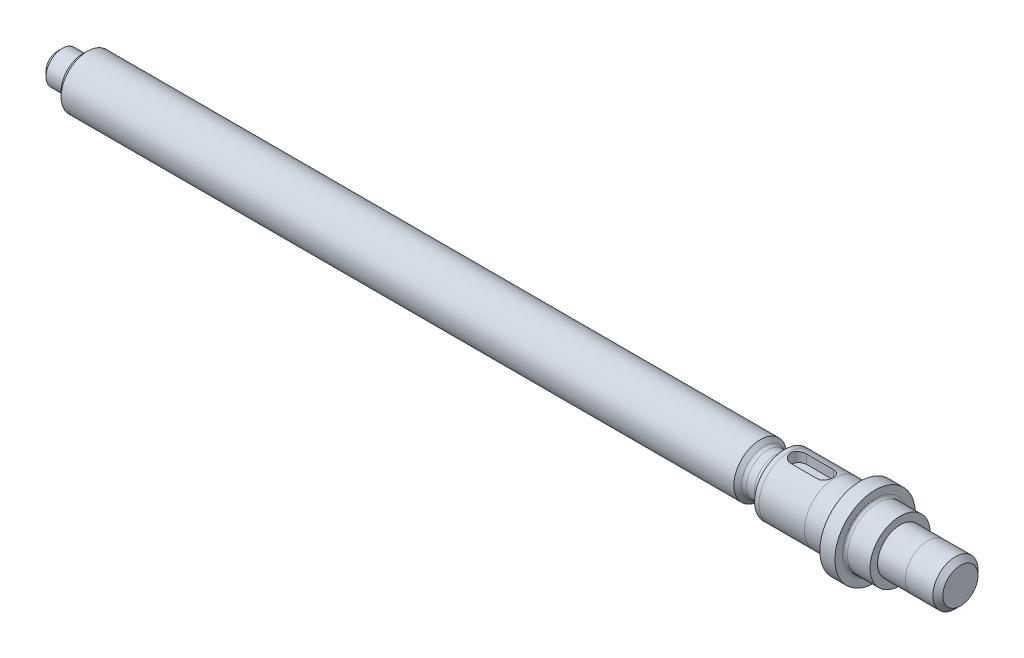
ISO-10303-21;
HEADER;
FILE_DESCRIPTION(('STEP AP214'),'2;1');
FILE_NAME('part.step','',(''),(''),'','','');
FILE_SCHEMA(('AUTOMOTIVE_DESIGN { 1 0 10303 214 1 1 1 1 }'));
ENDSEC;
DATA;
#1=APPLICATION_CONTEXT('core data for automotive mechanical design processes');
#2=APPLICATION_PROTOCOL_DEFINITION('international standard','automotive_design',2000,#1);
#3=PRODUCT_CONTEXT('',#1,'mechanical');
#4=PRODUCT('Part','Part','',(#3));
#5=PRODUCT_RELATED_PRODUCT_CATEGORY('part','',(#4));
#6=PRODUCT_DEFINITION_FORMATION('','',#4);
#7=PRODUCT_DEFINITION_CONTEXT('part definition',#1,'design');
#8=PRODUCT_DEFINITION('design','',#6,#7);
#9=PRODUCT_DEFINITION_SHAPE('','',#8);
#10=(LENGTH_UNIT() NAMED_UNIT(*) SI_UNIT(.MILLI.,.METRE.));
#11=(NAMED_UNIT(*) PLANE_ANGLE_UNIT() SI_UNIT($,.RADIAN.));
#12=(NAMED_UNIT(*) SI_UNIT($,.STERADIAN.) SOLID_ANGLE_UNIT());
#13=UNCERTAINTY_MEASURE_WITH_UNIT(LENGTH_MEASURE(1.E-05),#10,'distance_accuracy_value','');
#14=(GEOMETRIC_REPRESENTATION_CONTEXT(3) GLOBAL_UNCERTAINTY_ASSIGNED_CONTEXT((#13)) GLOBAL_UNIT_ASSIGNED_CONTEXT((#10,
#11,#12)) REPRESENTATION_CONTEXT('',''));
#15=CARTESIAN_POINT('',(0.,0.,0.));
#16=DIRECTION('',(0.,0.,1.));
#17=DIRECTION('',(1.,0.,0.));
#18=AXIS2_PLACEMENT_3D('',#15,#16,#17);
#19=CARTESIAN_POINT('',(55.7564116787131,0.,2.49726946320206));
#20=DIRECTION('',(1.,0.,0.));
#21=DIRECTION('',(0.,0.,-1.));
#22=AXIS2_PLACEMENT_3D('',#19,#20,#21);
#23=CYLINDRICAL_SURFACE('',#22,4.5);
#24=CARTESIAN_POINT('',(43.7564116787131,0.,2.49726946320206));
#25=DIRECTION('',(1.,0.,0.));
#26=DIRECTION('',(0.,0.,-1.));
#27=AXIS2_PLACEMENT_3D('',#24,#25,#26);
#28=CIRCLE('',#27,4.5);
#29=CARTESIAN_POINT('',(43.7564116787131,0.,-2.00273053679794));
#30=VERTEX_POINT('',#29);
#31=EDGE_CURVE('E118',#30,#30,#28,.T.);
#32=ORIENTED_EDGE('',*,*,#31,.T.);
#33=EDGE_LOOP('',(#32));
#34=FACE_BOUND('',#33,.T.);
#35=CARTESIAN_POINT('',(49.2564116787132,0.,2.49726946320206));
#36=DIRECTION('',(1.,0.,0.));
#37=DIRECTION('',(0.,0.,-1.));
#38=AXIS2_PLACEMENT_3D('',#35,#36,#37);
#39=CIRCLE('',#38,4.5);
#40=CARTESIAN_POINT('',(49.2564116787132,0.,-2.00273053679794));
#41=VERTEX_POINT('',#40);
#42=CARTESIAN_POINT('',(49.2564116787132,0.,6.99726946320206));
#43=VERTEX_POINT('',#42);
#44=EDGE_CURVE('E12',#41,#43,#39,.T.);
#45=ORIENTED_EDGE('',*,*,#44,.F.);
#46=EDGE_CURVE('E48',#43,#41,#39,.T.);
#47=ORIENTED_EDGE('',*,*,#46,.F.);
#48=EDGE_LOOP('',(#45,#47));
#49=FACE_BOUND('',#48,.T.);
#50=ADVANCED_FACE('F44',(#34,#49),#23,.T.);
#51=CARTESIAN_POINT('',(55.7564116787131,0.,2.49726946320206));
#52=DIRECTION('',(1.,0.,0.));
#53=DIRECTION('',(0.,0.,-1.));
#54=AXIS2_PLACEMENT_3D('',#51,#52,#53);
#55=CYLINDRICAL_SURFACE('',#54,6.);
#56=DIRECTION('',(1.,0.,0.));
#57=VECTOR('',#56,1.);
#58=CARTESIAN_POINT('',(55.7564116787131,5.78427857343611,4.0916726069797));
#59=LINE('',#58,#57);
#60=CARTESIAN_POINT('',(28.8683989605869,5.78427857343611,4.0916726069797));
#61=VERTEX_POINT('',#60);
#62=CARTESIAN_POINT('',(23.5508562536765,5.78427857343611,4.0916726069797));
#63=VERTEX_POINT('',#62);
#64=EDGE_CURVE('E185',#61,#63,#59,.F.);
#65=ORIENTED_EDGE('',*,*,#64,.T.);
#66=CARTESIAN_POINT('',(23.5508562536765,5.78427857343611,4.0916726069797));
#67=CARTESIAN_POINT('',(23.5068488408463,5.78427537470929,4.0916732538895));
#68=CARTESIAN_POINT('',(23.462863337569,5.78478143129884,4.08984945884592));
#69=CARTESIAN_POINT('',(23.3752232596121,5.78677909814746,4.0825797926963));
#70=CARTESIAN_POINT('',(23.3315686253125,5.78827052636404,4.07713459062591));
#71=CARTESIAN_POINT('',(23.2017691493449,5.79416184620568,4.05544983439344));
#72=CARTESIAN_POINT('',(23.1165194102947,5.7999791682138,4.03386074856213));
#73=CARTESIAN_POINT('',(22.9510220426751,5.81471085083434,3.9771290336548));
#74=CARTESIAN_POINT('',(22.8707735725419,5.82362468872731,3.94198869204124));
#75=CARTESIAN_POINT('',(22.7172652215831,5.84353960117569,3.85919902404648));
#76=CARTESIAN_POINT('',(22.644007635074,5.85454135744235,3.81154561015683));
#77=CARTESIAN_POINT('',(22.5047920720793,5.8776954351342,3.70383066791852));
#78=CARTESIAN_POINT('',(22.4390330883749,5.88986792942943,3.64351634913917));
#79=CARTESIAN_POINT('',(22.3184299097202,5.91381879213698,3.5127301842721));
#80=CARTESIAN_POINT('',(22.2635874850385,5.92559709636882,3.44225669392605));
#81=CARTESIAN_POINT('',(22.1655463804298,5.9476581552028,3.29176803994546));
#82=CARTESIAN_POINT('',(22.1225466286126,5.9579141629704,3.21161901945396));
#83=CARTESIAN_POINT('',(22.0507100073433,5.9755416758513,3.04491505372384));
#84=CARTESIAN_POINT('',(22.0218700973222,5.98291380015703,2.95836148834238));
#85=CARTESIAN_POINT('',(21.9798163830287,5.99380009452295,2.78339123484563));
#86=CARTESIAN_POINT('',(21.9662621012602,5.99739819537028,2.69506169319851));
#87=CARTESIAN_POINT('',(21.9540932252812,6.00062447393384,2.51731209825912));
#88=CARTESIAN_POINT('',(21.9554764723815,6.0002532252786,2.42789220440411));
#89=CARTESIAN_POINT('',(21.9729039161297,5.99564402950704,2.25287349106129));
#90=CARTESIAN_POINT('',(21.9885799637591,5.99150318254061,2.16723506595205));
#91=CARTESIAN_POINT('',(22.0335532546752,5.97993461992083,1.99985178149587));
#92=CARTESIAN_POINT('',(22.0628511414559,5.97250674898967,1.91810710629036));
#93=CARTESIAN_POINT('',(22.1345198538785,5.95505436207852,1.75988836051495));
#94=CARTESIAN_POINT('',(22.1770172573088,5.94500486198886,1.68347449571513));
#95=CARTESIAN_POINT('',(22.2737809212341,5.92339272334005,1.53873862490472));
#96=CARTESIAN_POINT('',(22.3280492235928,5.91182982239385,1.47041802599257));
#97=CARTESIAN_POINT('',(22.4487622289074,5.88802935621152,1.34161601608273));
#98=CARTESIAN_POINT('',(22.5155268561428,5.87578196687882,1.28143593978486));
#99=CARTESIAN_POINT('',(22.6583461417694,5.85230737634666,1.1730399234606));
#100=CARTESIAN_POINT('',(22.7344033598321,5.84108045773075,1.12482729103905));
#101=CARTESIAN_POINT('',(22.8943115791374,5.82087632807864,1.04150299705484));
#102=CARTESIAN_POINT('',(22.9782107910959,5.81191448411084,1.0064800736422));
#103=CARTESIAN_POINT('',(23.1509558298625,5.79745069436156,0.95117885691595));
#104=CARTESIAN_POINT('',(23.2397940103836,5.79194355407461,0.930878419607432));
#105=CARTESIAN_POINT('',(23.3663266811218,5.78710399684012,0.913145952797162));
#106=CARTESIAN_POINT('',(23.4031488002886,5.7860462934765,0.909290720524958));
#107=CARTESIAN_POINT('',(23.4769267497318,5.78463378326177,0.904153643976452));
#108=CARTESIAN_POINT('',(23.5138822748872,5.78427786306878,0.902867723579425));
#109=CARTESIAN_POINT('',(23.5508562536765,5.78427857343611,0.902866319424424));
#110=B_SPLINE_CURVE_WITH_KNOTS('',3,(#66,#67,#68,#69,#70,#71,#72,#73,#74,#75,#76,#77,#78,#79,
#80,#81,#82,#83,#84,#85,#86,#87,#88,#89,#90,#91,#92,#93,#94,#95,#96,#97,#98,#99,#100,#101,#102,
#103,#104,#105,#106,#107,#108,#109),.UNSPECIFIED.,.F.,.F.,(4,2,2,2,2,2,2,2,2,2,2,2,2,2,2,2,2,2,
2,2,2,4),(0.,0.131938510748486,0.263852653328836,0.526883552292819,0.789870070858429,
1.05294260345431,1.32187620583464,1.5908533839948,1.86410584976431,2.13729961383888,
2.40427993660933,2.67122167737401,2.93147608822933,3.19174279472142,3.45458670785014,
3.71747625226492,3.98835510083645,4.25930873271848,4.53205404303268,4.80438826326253,
4.91542581528944,5.02628706992377),.UNSPECIFIED.);
#111=CARTESIAN_POINT('',(23.5508562536765,5.78427857343611,0.902866319424424));
#112=VERTEX_POINT('',#111);
#113=EDGE_CURVE('E95',#63,#112,#110,.T.);
#114=ORIENTED_EDGE('',*,*,#113,.T.);
#115=DIRECTION('',(1.,0.,0.));
#116=VECTOR('',#115,1.);
#117=CARTESIAN_POINT('',(55.7564116787131,5.78427857343611,0.902866319424424));
#118=LINE('',#117,#116);
#119=CARTESIAN_POINT('',(28.8683989605869,5.78427857343611,0.902866319424424));
#120=VERTEX_POINT('',#119);
#121=EDGE_CURVE('E195',#112,#120,#118,.T.);
#122=ORIENTED_EDGE('',*,*,#121,.T.);
#123=CARTESIAN_POINT('',(28.8683989605869,5.78427857343611,0.902866319424424));
#124=CARTESIAN_POINT('',(28.9124063734172,5.78427537470929,0.902865672514622));
#125=CARTESIAN_POINT('',(28.9563918766944,5.78478143129884,0.904689467558201));
#126=CARTESIAN_POINT('',(29.0440319546514,5.78677909814746,0.911959133707823));
#127=CARTESIAN_POINT('',(29.087686588951,5.78827052636404,0.917404335778219));
#128=CARTESIAN_POINT('',(29.2174860649185,5.79416184620568,0.939089092010686));
#129=CARTESIAN_POINT('',(29.3027358039687,5.7999791682138,0.960678177841992));
#130=CARTESIAN_POINT('',(29.4682331715883,5.81471085083434,1.01740989274933));
#131=CARTESIAN_POINT('',(29.5484816417216,5.82362468872731,1.05255023436289));
#132=CARTESIAN_POINT('',(29.7019899926804,5.84353960117569,1.13533990235765));
#133=CARTESIAN_POINT('',(29.7752475791894,5.85454135744235,1.1829933162473));
#134=CARTESIAN_POINT('',(29.9144631421842,5.8776954351342,1.2907082584856));
#135=CARTESIAN_POINT('',(29.9802221258885,5.88986792942943,1.35102257726495));
#136=CARTESIAN_POINT('',(30.1008253045433,5.91381879213698,1.48180874213203));
#137=CARTESIAN_POINT('',(30.155667729225,5.92559709636882,1.55228223247808));
#138=CARTESIAN_POINT('',(30.2537088338337,5.9476581552028,1.70277088645866));
#139=CARTESIAN_POINT('',(30.2967085856508,5.9579141629704,1.78291990695017));
#140=CARTESIAN_POINT('',(30.3685452069202,5.9755416758513,1.94962387268029));
#141=CARTESIAN_POINT('',(30.3973851169413,5.98291380015703,2.03617743806174));
#142=CARTESIAN_POINT('',(30.4394388312348,5.99380009452295,2.2111476915585));
#143=CARTESIAN_POINT('',(30.4529931130032,5.99739819537028,2.29947723320561));
#144=CARTESIAN_POINT('',(30.4651619889823,6.00062447393384,2.47722682814501));
#145=CARTESIAN_POINT('',(30.463778741882,6.0002532252786,2.56664672200001));
#146=CARTESIAN_POINT('',(30.4463512981337,5.99564402950704,2.74166543534283));
#147=CARTESIAN_POINT('',(30.4306752505043,5.99150318254061,2.82730386045207));
#148=CARTESIAN_POINT('',(30.3857019595883,5.97993461992083,2.99468714490825));
#149=CARTESIAN_POINT('',(30.3564040728076,5.97250674898967,3.07643182011376));
#150=CARTESIAN_POINT('',(30.284735360385,5.95505436207852,3.23465056588918));
#151=CARTESIAN_POINT('',(30.2422379569547,5.94500486198886,3.31106443068899));
#152=CARTESIAN_POINT('',(30.1454742930294,5.92339272334005,3.4558003014994));
#153=CARTESIAN_POINT('',(30.0912059906707,5.91182982239385,3.52412090041155));
#154=CARTESIAN_POINT('',(29.970492985356,5.88802935621152,3.65292291032139));
#155=CARTESIAN_POINT('',(29.9037283581206,5.87578196687882,3.71310298661927));
#156=CARTESIAN_POINT('',(29.760909072494,5.85230737634666,3.82149900294352));
#157=CARTESIAN_POINT('',(29.6848518544313,5.84108045773075,3.86971163536507));
#158=CARTESIAN_POINT('',(29.5249436351261,5.82087632807864,3.95303592934928));
#159=CARTESIAN_POINT('',(29.4410444231676,5.81191448411084,3.98805885276193));
#160=CARTESIAN_POINT('',(29.268299384401,5.79745069436156,4.04336006948818));
#161=CARTESIAN_POINT('',(29.1794612038798,5.79194355407461,4.06366050679669));
#162=CARTESIAN_POINT('',(29.0529285331416,5.78710399684012,4.08139297360696));
#163=CARTESIAN_POINT('',(29.0161064139748,5.7860462934765,4.08524820587917));
#164=CARTESIAN_POINT('',(28.9423284645317,5.78463378326177,4.09038528242767));
#165=CARTESIAN_POINT('',(28.9053729393763,5.78427786306878,4.0916712028247));
#166=CARTESIAN_POINT('',(28.8683989605869,5.78427857343611,4.0916726069797));
#167=B_SPLINE_CURVE_WITH_KNOTS('',3,(#123,#124,#125,#126,#127,#128,#129,#130,#131,#132,#133,
#134,#135,#136,#137,#138,#139,#140,#141,#142,#143,#144,#145,#146,#147,#148,#149,#150,#151,#152,
#153,#154,#155,#156,#157,#158,#159,#160,#161,#162,#163,#164,#165,#166),.UNSPECIFIED.,.F.,.F.,(4,
2,2,2,2,2,2,2,2,2,2,2,2,2,2,2,2,2,2,2,2,4),(0.,0.131938510748486,0.263852653328836,
0.526883552292819,0.789870070858433,1.05294260345431,1.32187620583464,1.5908533839948,
1.86410584976431,2.13729961383888,2.40427993660933,2.67122167737401,2.93147608822933,
3.19174279472142,3.45458670785014,3.71747625226492,3.98835510083645,4.25930873271848,
4.53205404303268,4.80438826326253,4.91542581528944,5.02628706992377),.UNSPECIFIED.);
#168=EDGE_CURVE('E187',#120,#61,#167,.T.);
#169=ORIENTED_EDGE('',*,*,#168,.T.);
#170=EDGE_LOOP('',(#65,#114,#122,#169));
#171=FACE_BOUND('',#170,.T.);
#172=CARTESIAN_POINT('',(30.6810087566276,0.,2.49726946320206));
#173=DIRECTION('',(-1.,0.,0.));
#174=DIRECTION('',(0.,0.,1.));
#175=AXIS2_PLACEMENT_3D('',#172,#173,#174);
#176=CIRCLE('',#175,6.);
#177=CARTESIAN_POINT('',(30.6810087566276,0.,8.49726946320206));
#178=VERTEX_POINT('',#177);
#179=EDGE_CURVE('E220',#178,#178,#176,.T.);
#180=ORIENTED_EDGE('',*,*,#179,.T.);
#181=EDGE_LOOP('',(#180));
#182=FACE_BOUND('',#181,.T.);
#183=CARTESIAN_POINT('',(21.6418085357315,0.,2.49726946320206));
#184=DIRECTION('',(-1.,0.,0.));
#185=DIRECTION('',(0.,0.,1.));
#186=AXIS2_PLACEMENT_3D('',#183,#184,#185);
#187=CIRCLE('',#186,6.);
#188=CARTESIAN_POINT('',(21.6418085357315,0.,8.49726946320206));
#189=VERTEX_POINT('',#188);
#190=EDGE_CURVE('E223',#189,#189,#187,.T.);
#191=ORIENTED_EDGE('',*,*,#190,.F.);
#192=EDGE_LOOP('',(#191));
#193=FACE_BOUND('',#192,.T.);
#194=ADVANCED_FACE('F236',(#171,#182,#193),#55,.T.);
#195=CARTESIAN_POINT('',(35.2564116787131,0.,2.49726946320206));
#196=DIRECTION('',(1.,0.,0.));
#197=DIRECTION('',(0.,0.,-1.));
#198=AXIS2_PLACEMENT_3D('',#195,#196,#197);
#199=CIRCLE('',#198,6.);
#200=CARTESIAN_POINT('',(35.2564116787131,0.,-3.50273053679794));
#201=VERTEX_POINT('',#200);
#202=EDGE_CURVE('E143',#201,#201,#199,.F.);
#203=ORIENTED_EDGE('',*,*,#202,.T.);
#204=EDGE_LOOP('',(#203));
#205=FACE_BOUND('',#204,.T.);
#206=ORIENTED_EDGE('',*,*,#179,.F.);
#207=EDGE_LOOP('',(#206));
#208=FACE_BOUND('',#207,.T.);
#209=ADVANCED_FACE('F241',(#205,#208),#55,.T.);
#210=CARTESIAN_POINT('',(-119.589435131002,0.,2.49726946320206));
#211=DIRECTION('',(1.,0.,0.));
#212=DIRECTION('',(0.,0.,-1.));
#213=AXIS2_PLACEMENT_3D('',#210,#211,#212);
#214=TOROIDAL_SURFACE('',#213,3.76066017177983,0.5);
#215=CARTESIAN_POINT('',(-119.089435131002,0.,2.49726946320206));
#216=DIRECTION('',(1.,0.,0.));
#217=DIRECTION('',(0.,0.,-1.));
#218=AXIS2_PLACEMENT_3D('',#215,#216,#217);
#219=CIRCLE('',#218,3.76066017177983);
#220=CARTESIAN_POINT('',(-119.089435131002,0.,-1.26339070857777));
#221=VERTEX_POINT('',#220);
#222=EDGE_CURVE('E161',#221,#221,#219,.T.);
#223=ORIENTED_EDGE('',*,*,#222,.F.);
#224=EDGE_LOOP('',(#223));
#225=FACE_BOUND('',#224,.T.);
#226=CARTESIAN_POINT('',(-119.589435131002,0.,2.49726946320206));
#227=DIRECTION('',(1.,0.,0.));
#228=DIRECTION('',(0.,0.,-1.));
#229=AXIS2_PLACEMENT_3D('',#226,#227,#228);
#230=CIRCLE('',#229,3.26066017177983);
#231=CARTESIAN_POINT('',(-119.589435131002,0.,-0.763390708577772));
#232=VERTEX_POINT('',#231);
#233=EDGE_CURVE('E164',#232,#232,#230,.F.);
#234=ORIENTED_EDGE('',*,*,#233,.F.);
#235=EDGE_LOOP('',(#234));
#236=FACE_BOUND('',#235,.T.);
#237=ADVANCED_FACE('F302',(#225,#236),#214,.F.);
#238=CARTESIAN_POINT('',(17.3706252410863,0.,2.49726946320206));
#239=DIRECTION('',(-1.,0.,0.));
#240=DIRECTION('',(0.,0.,1.));
#241=AXIS2_PLACEMENT_3D('',#238,#239,#240);
#242=TOROIDAL_SURFACE('',#241,5.2,1.);
#243=CARTESIAN_POINT('',(16.6635184598997,0.,2.49726946320206));
#244=DIRECTION('',(-1.,0.,0.));
#245=DIRECTION('',(0.,0.,1.));
#246=AXIS2_PLACEMENT_3D('',#243,#244,#245);
#247=CIRCLE('',#246,4.49289321881346);
#248=CARTESIAN_POINT('',(16.6635184598997,0.,6.99016268201552));
#249=VERTEX_POINT('',#248);
#250=EDGE_CURVE('E154',#249,#249,#247,.T.);
#251=ORIENTED_EDGE('',*,*,#250,.F.);
#252=EDGE_LOOP('',(#251));
#253=FACE_BOUND('',#252,.T.);
#254=CARTESIAN_POINT('',(17.3706252410863,0.,2.49726946320206));
#255=DIRECTION('',(-1.,0.,0.));
#256=DIRECTION('',(0.,0.,1.));
#257=AXIS2_PLACEMENT_3D('',#254,#255,#256);
#258=CIRCLE('',#257,4.2);
#259=CARTESIAN_POINT('',(17.3706252410863,0.,6.69726946320207));
#260=VERTEX_POINT('',#259);
#261=EDGE_CURVE('E158',#260,#260,#258,.F.);
#262=ORIENTED_EDGE('',*,*,#261,.F.);
#263=EDGE_LOOP('',(#262));
#264=FACE_BOUND('',#263,.T.);
#265=ADVANCED_FACE('F294',(#253,#264),#242,.F.);
#266=CARTESIAN_POINT('',(39.2564116787131,0.,2.49726946320206));
#267=DIRECTION('',(-1.,0.,0.));
#268=DIRECTION('',(0.,0.,1.));
#269=AXIS2_PLACEMENT_3D('',#266,#267,#268);
#270=TOROIDAL_SURFACE('',#269,6.5,0.5);
#271=CARTESIAN_POINT('',(38.7564116787131,0.,2.49726946320206));
#272=DIRECTION('',(-1.,0.,0.));
#273=DIRECTION('',(0.,0.,1.));
#274=AXIS2_PLACEMENT_3D('',#271,#272,#273);
#275=CIRCLE('',#274,6.5);
#276=CARTESIAN_POINT('',(38.7564116787131,0.,8.99726946320206));
#277=VERTEX_POINT('',#276);
#278=EDGE_CURVE('E149',#277,#277,#275,.T.);
#279=ORIENTED_EDGE('',*,*,#278,.F.);
#280=EDGE_LOOP('',(#279));
#281=FACE_BOUND('',#280,.T.);
#282=CARTESIAN_POINT('',(39.2564116787131,0.,2.49726946320206));
#283=DIRECTION('',(-1.,0.,0.));
#284=DIRECTION('',(0.,0.,1.));
#285=AXIS2_PLACEMENT_3D('',#282,#283,#284);
#286=CIRCLE('',#285,6.);
#287=CARTESIAN_POINT('',(39.2564116787131,0.,8.49726946320206));
#288=VERTEX_POINT('',#287);
#289=EDGE_CURVE('E152',#288,#288,#286,.F.);
#290=ORIENTED_EDGE('',*,*,#289,.F.);
#291=EDGE_LOOP('',(#290));
#292=FACE_BOUND('',#291,.T.);
#293=ADVANCED_FACE('F284',(#281,#292),#270,.F.);
#294=CARTESIAN_POINT('',(35.2564116787131,0.,2.49726946320206));
#295=DIRECTION('',(1.,0.,0.));
#296=DIRECTION('',(0.,0.,-1.));
#297=AXIS2_PLACEMENT_3D('',#294,#295,#296);
#298=TOROIDAL_SURFACE('',#297,6.5,0.5);
#299=ORIENTED_EDGE('',*,*,#202,.F.);
#300=EDGE_LOOP('',(#299));
#301=FACE_BOUND('',#300,.T.);
#302=CARTESIAN_POINT('',(35.7564116787131,0.,2.49726946320206));
#303=DIRECTION('',(1.,0.,0.));
#304=DIRECTION('',(0.,0.,-1.));
#305=AXIS2_PLACEMENT_3D('',#302,#303,#304);
#306=CIRCLE('',#305,6.5);
#307=CARTESIAN_POINT('',(35.7564116787131,0.,-4.00273053679794));
#308=VERTEX_POINT('',#307);
#309=EDGE_CURVE('E146',#308,#308,#306,.T.);
#310=ORIENTED_EDGE('',*,*,#309,.F.);
#311=EDGE_LOOP('',(#310));
#312=FACE_BOUND('',#311,.T.);
#313=ADVANCED_FACE('F281',(#301,#312),#298,.F.);
#314=CARTESIAN_POINT('',(-124.089435131002,0.,5.7579296349819));
#315=DIRECTION('',(1.,0.,0.));
#316=DIRECTION('',(0.,0.,-1.));
#317=AXIS2_PLACEMENT_3D('',#314,#315,#316);
#318=PLANE('',#317);
#319=CARTESIAN_POINT('',(-124.089435131002,0.,2.49726946320206));
#320=DIRECTION('',(1.,0.,0.));
#321=DIRECTION('',(0.,0.,-1.));
#322=AXIS2_PLACEMENT_3D('',#319,#320,#321);
#323=CIRCLE('',#322,2.26066017177987);
#324=CARTESIAN_POINT('',(-124.089435131002,0.,0.236609291422198));
#325=VERTEX_POINT('',#324);
#326=EDGE_CURVE('E182',#325,#325,#323,.F.);
#327=ORIENTED_EDGE('',*,*,#326,.T.);
#328=EDGE_LOOP('',(#327));
#329=FACE_BOUND('',#328,.T.);
#330=ADVANCED_FACE('F283',(#329),#318,.F.);
#331=CARTESIAN_POINT('',(55.7564116787131,0.,2.49726946320206));
#332=DIRECTION('',(1.,0.,0.));
#333=DIRECTION('',(0.,0.,-1.));
#334=AXIS2_PLACEMENT_3D('',#331,#332,#333);
#335=CYLINDRICAL_SURFACE('',#334,3.26066017177983);
#336=CARTESIAN_POINT('',(-123.089435131002,0.,2.49726946320206));
#337=DIRECTION('',(1.,0.,0.));
#338=DIRECTION('',(0.,0.,-1.));
#339=AXIS2_PLACEMENT_3D('',#336,#337,#338);
#340=CIRCLE('',#339,3.26066017177983);
#341=CARTESIAN_POINT('',(-123.089435131002,0.,-0.763390708577772));
#342=VERTEX_POINT('',#341);
#343=EDGE_CURVE('E179',#342,#342,#340,.T.);
#344=ORIENTED_EDGE('',*,*,#343,.T.);
#345=EDGE_LOOP('',(#344));
#346=FACE_BOUND('',#345,.T.);
#347=ORIENTED_EDGE('',*,*,#233,.T.);
#348=EDGE_LOOP('',(#347));
#349=FACE_BOUND('',#348,.T.);
#350=ADVANCED_FACE('F291',(#346,#349),#335,.T.);
#351=CARTESIAN_POINT('',(-119.089435131002,0.,7.7579296349819));
#352=DIRECTION('',(1.,0.,0.));
#353=DIRECTION('',(0.,0.,-1.));
#354=AXIS2_PLACEMENT_3D('',#351,#352,#353);
#355=PLANE('',#354);
#356=CARTESIAN_POINT('',(-119.089435131002,0.,2.49726946320206));
#357=DIRECTION('',(1.,0.,0.));
#358=DIRECTION('',(0.,0.,-1.));
#359=AXIS2_PLACEMENT_3D('',#356,#357,#358);
#360=CIRCLE('',#359,4.26066017177984);
#361=CARTESIAN_POINT('',(-119.089435131002,0.,-1.76339070857778));
#362=VERTEX_POINT('',#361);
#363=EDGE_CURVE('E176',#362,#362,#360,.F.);
#364=ORIENTED_EDGE('',*,*,#363,.T.);
#365=EDGE_LOOP('',(#364));
#366=FACE_BOUND('',#365,.T.);
#367=ORIENTED_EDGE('',*,*,#222,.T.);
#368=EDGE_LOOP('',(#367));
#369=FACE_BOUND('',#368,.T.);
#370=ADVANCED_FACE('F324',(#366,#369),#355,.F.);
#371=CARTESIAN_POINT('',(55.7564116787131,0.,2.49726946320206));
#372=DIRECTION('',(1.,0.,0.));
#373=DIRECTION('',(0.,0.,-1.));
#374=AXIS2_PLACEMENT_3D('',#371,#372,#373);
#375=CYLINDRICAL_SURFACE('',#374,5.26066017177983);
#376=CARTESIAN_POINT('',(-118.089435131002,0.,2.49726946320206));
#377=DIRECTION('',(1.,0.,0.));
#378=DIRECTION('',(0.,0.,-1.));
#379=AXIS2_PLACEMENT_3D('',#376,#377,#378);
#380=CIRCLE('',#379,5.26066017177983);
#381=CARTESIAN_POINT('',(-118.089435131002,0.,-2.76339070857777));
#382=VERTEX_POINT('',#381);
#383=EDGE_CURVE('E173',#382,#382,#380,.T.);
#384=ORIENTED_EDGE('',*,*,#383,.T.);
#385=EDGE_LOOP('',(#384));
#386=FACE_BOUND('',#385,.T.);
#387=CARTESIAN_POINT('',(15.8957515069333,0.,2.49726946320206));
#388=DIRECTION('',(1.,0.,0.));
#389=DIRECTION('',(0.,0.,-1.));
#390=AXIS2_PLACEMENT_3D('',#387,#388,#389);
#391=CIRCLE('',#390,5.26066017177983);
#392=CARTESIAN_POINT('',(15.8957515069333,0.,-2.76339070857777));
#393=VERTEX_POINT('',#392);
#394=EDGE_CURVE('E140',#393,#393,#391,.T.);
#395=ORIENTED_EDGE('',*,*,#394,.F.);
#396=EDGE_LOOP('',(#395));
#397=FACE_BOUND('',#396,.T.);
#398=ADVANCED_FACE('F320',(#386,#397),#375,.T.);
#399=CARTESIAN_POINT('',(15.8957515069333,0.,2.49726946320206));
#400=DIRECTION('',(-1.,0.,0.));
#401=DIRECTION('',(0.,0.,1.));
#402=AXIS2_PLACEMENT_3D('',#399,#400,#401);
#403=CONICAL_SURFACE('',#402,5.26066017177983,0.785398163397458);
#404=ORIENTED_EDGE('',*,*,#250,.T.);
#405=EDGE_LOOP('',(#404));
#406=FACE_BOUND('',#405,.T.);
#407=ORIENTED_EDGE('',*,*,#394,.T.);
#408=EDGE_LOOP('',(#407));
#409=FACE_BOUND('',#408,.T.);
#410=ADVANCED_FACE('F323',(#406,#409),#403,.T.);
#411=CARTESIAN_POINT('',(55.7564116787131,0.,2.49726946320206));
#412=DIRECTION('',(1.,0.,0.));
#413=DIRECTION('',(0.,0.,-1.));
#414=AXIS2_PLACEMENT_3D('',#411,#412,#413);
#415=CYLINDRICAL_SURFACE('',#414,4.2);
#416=ORIENTED_EDGE('',*,*,#261,.T.);
#417=EDGE_LOOP('',(#416));
#418=FACE_BOUND('',#417,.T.);
#419=CARTESIAN_POINT('',(18.9564116787132,0.,2.49726946320206));
#420=DIRECTION('',(1.,0.,0.));
#421=DIRECTION('',(0.,0.,-1.));
#422=AXIS2_PLACEMENT_3D('',#419,#420,#421);
#423=CIRCLE('',#422,4.2);
#424=CARTESIAN_POINT('',(18.9564116787132,0.,-1.70273053679794));
#425=VERTEX_POINT('',#424);
#426=EDGE_CURVE('E137',#425,#425,#423,.T.);
#427=ORIENTED_EDGE('',*,*,#426,.F.);
#428=EDGE_LOOP('',(#427));
#429=FACE_BOUND('',#428,.T.);
#430=ADVANCED_FACE('F329',(#418,#429),#415,.T.);
#431=CARTESIAN_POINT('',(18.9564116787132,0.,2.49726946320206));
#432=DIRECTION('',(1.,0.,0.));
#433=DIRECTION('',(0.,0.,-1.));
#434=AXIS2_PLACEMENT_3D('',#431,#432,#433);
#435=TOROIDAL_SURFACE('',#434,6.,1.8);
#436=CARTESIAN_POINT('',(20.7564116787131,0.,2.49726946320206));
#437=DIRECTION('',(1.,0.,0.));
#438=DIRECTION('',(0.,0.,-1.));
#439=AXIS2_PLACEMENT_3D('',#436,#437,#438);
#440=CIRCLE('',#439,6.00000000000001);
#441=CARTESIAN_POINT('',(20.7564116787131,0.,-3.50273053679794));
#442=VERTEX_POINT('',#441);
#443=EDGE_CURVE('E134',#442,#442,#440,.T.);
#444=ORIENTED_EDGE('',*,*,#443,.F.);
#445=EDGE_LOOP('',(#444));
#446=FACE_BOUND('',#445,.T.);
#447=ORIENTED_EDGE('',*,*,#426,.T.);
#448=EDGE_LOOP('',(#447));
#449=FACE_BOUND('',#448,.T.);
#450=ADVANCED_FACE('F275',(#446,#449),#435,.F.);
#451=ORIENTED_EDGE('',*,*,#190,.T.);
#452=EDGE_LOOP('',(#451));
#453=FACE_BOUND('',#452,.T.);
#454=ORIENTED_EDGE('',*,*,#443,.T.);
#455=EDGE_LOOP('',(#454));
#456=FACE_BOUND('',#455,.T.);
#457=ADVANCED_FACE('F197',(#453,#456),#55,.T.);
#458=CARTESIAN_POINT('',(35.7564116787131,0.,10.4972694632021));
#459=DIRECTION('',(1.,0.,0.));
#460=DIRECTION('',(0.,0.,-1.));
#461=AXIS2_PLACEMENT_3D('',#458,#459,#460);
#462=PLANE('',#461);
#463=ORIENTED_EDGE('',*,*,#309,.T.);
#464=EDGE_LOOP('',(#463));
#465=FACE_BOUND('',#464,.T.);
#466=CARTESIAN_POINT('',(35.7564116787131,0.,2.49726946320206));
#467=DIRECTION('',(1.,0.,0.));
#468=DIRECTION('',(0.,0.,-1.));
#469=AXIS2_PLACEMENT_3D('',#466,#467,#468);
#470=CIRCLE('',#469,8.);
#471=CARTESIAN_POINT('',(35.7564116787131,0.,-5.50273053679794));
#472=VERTEX_POINT('',#471);
#473=EDGE_CURVE('E131',#472,#472,#470,.T.);
#474=ORIENTED_EDGE('',*,*,#473,.F.);
#475=EDGE_LOOP('',(#474));
#476=FACE_BOUND('',#475,.T.);
#477=ADVANCED_FACE('F268',(#465,#476),#462,.F.);
#478=CARTESIAN_POINT('',(55.7564116787131,0.,2.49726946320206));
#479=DIRECTION('',(1.,0.,0.));
#480=DIRECTION('',(0.,0.,-1.));
#481=AXIS2_PLACEMENT_3D('',#478,#479,#480);
#482=CYLINDRICAL_SURFACE('',#481,8.);
#483=CARTESIAN_POINT('',(38.7564116787131,0.,2.49726946320206));
#484=DIRECTION('',(1.,0.,0.));
#485=DIRECTION('',(0.,0.,-1.));
#486=AXIS2_PLACEMENT_3D('',#483,#484,#485);
#487=CIRCLE('',#486,8.);
#488=CARTESIAN_POINT('',(38.7564116787131,0.,-5.50273053679794));
#489=VERTEX_POINT('',#488);
#490=EDGE_CURVE('E128',#489,#489,#487,.T.);
#491=ORIENTED_EDGE('',*,*,#490,.F.);
#492=EDGE_LOOP('',(#491));
#493=FACE_BOUND('',#492,.T.);
#494=ORIENTED_EDGE('',*,*,#473,.T.);
#495=EDGE_LOOP('',(#494));
#496=FACE_BOUND('',#495,.T.);
#497=ADVANCED_FACE('F265',(#493,#496),#482,.T.);
#498=CARTESIAN_POINT('',(38.7564116787131,0.,8.49726946320206));
#499=DIRECTION('',(-1.,0.,0.));
#500=DIRECTION('',(0.,0.,1.));
#501=AXIS2_PLACEMENT_3D('',#498,#499,#500);
#502=PLANE('',#501);
#503=ORIENTED_EDGE('',*,*,#278,.T.);
#504=EDGE_LOOP('',(#503));
#505=FACE_BOUND('',#504,.T.);
#506=ORIENTED_EDGE('',*,*,#490,.T.);
#507=EDGE_LOOP('',(#506));
#508=FACE_BOUND('',#507,.T.);
#509=ADVANCED_FACE('F257',(#505,#508),#502,.F.);
#510=CARTESIAN_POINT('',(55.7564116787131,0.,2.49726946320206));
#511=DIRECTION('',(1.,0.,0.));
#512=DIRECTION('',(0.,0.,-1.));
#513=AXIS2_PLACEMENT_3D('',#510,#511,#512);
#514=CYLINDRICAL_SURFACE('',#513,6.);
#515=ORIENTED_EDGE('',*,*,#289,.T.);
#516=EDGE_LOOP('',(#515));
#517=FACE_BOUND('',#516,.T.);
#518=CARTESIAN_POINT('',(43.7564116787131,0.,2.49726946320206));
#519=DIRECTION('',(1.,0.,0.));
#520=DIRECTION('',(0.,0.,-1.));
#521=AXIS2_PLACEMENT_3D('',#518,#519,#520);
#522=CIRCLE('',#521,6.);
#523=CARTESIAN_POINT('',(43.7564116787131,0.,-3.50273053679794));
#524=VERTEX_POINT('',#523);
#525=EDGE_CURVE('E125',#524,#524,#522,.T.);
#526=ORIENTED_EDGE('',*,*,#525,.F.);
#527=EDGE_LOOP('',(#526));
#528=FACE_BOUND('',#527,.T.);
#529=ADVANCED_FACE('F252',(#517,#528),#514,.T.);
#530=CARTESIAN_POINT('',(43.7564116787131,0.,6.99726946320206));
#531=DIRECTION('',(-1.,0.,0.));
#532=DIRECTION('',(0.,0.,1.));
#533=AXIS2_PLACEMENT_3D('',#530,#531,#532);
#534=PLANE('',#533);
#535=ORIENTED_EDGE('',*,*,#31,.F.);
#536=EDGE_LOOP('',(#535));
#537=FACE_BOUND('',#536,.T.);
#538=ORIENTED_EDGE('',*,*,#525,.T.);
#539=EDGE_LOOP('',(#538));
#540=FACE_BOUND('',#539,.T.);
#541=ADVANCED_FACE('F245',(#537,#540),#534,.F.);
#542=ORIENTED_EDGE('',*,*,#46,.T.);
#543=ORIENTED_EDGE('',*,*,#44,.T.);
#544=EDGE_LOOP('',(#542,#543));
#545=FACE_BOUND('',#544,.T.);
#546=CARTESIAN_POINT('',(54.7564116787131,0.,2.49726946320206));
#547=DIRECTION('',(-1.,0.,0.));
#548=DIRECTION('',(0.,0.,1.));
#549=AXIS2_PLACEMENT_3D('',#546,#547,#548);
#550=CIRCLE('',#549,4.5);
#551=CARTESIAN_POINT('',(54.7564116787131,0.,6.99726946320206));
#552=VERTEX_POINT('',#551);
#553=EDGE_CURVE('E170',#552,#552,#550,.T.);
#554=ORIENTED_EDGE('',*,*,#553,.T.);
#555=EDGE_LOOP('',(#554));
#556=FACE_BOUND('',#555,.T.);
#557=ADVANCED_FACE('F233',(#545,#556),#23,.T.);
#558=CARTESIAN_POINT('',(55.7564116787131,0.,2.49726946320206));
#559=DIRECTION('',(-1.,0.,0.));
#560=DIRECTION('',(0.,0.,1.));
#561=AXIS2_PLACEMENT_3D('',#558,#559,#560);
#562=PLANE('',#561);
#563=CARTESIAN_POINT('',(55.7564116787131,0.,2.49726946320206));
#564=DIRECTION('',(-1.,0.,0.));
#565=DIRECTION('',(0.,0.,1.));
#566=AXIS2_PLACEMENT_3D('',#563,#564,#565);
#567=CIRCLE('',#566,3.5);
#568=CARTESIAN_POINT('',(55.7564116787131,0.,5.99726946320207));
#569=VERTEX_POINT('',#568);
#570=EDGE_CURVE('E167',#569,#569,#567,.F.);
#571=ORIENTED_EDGE('',*,*,#570,.T.);
#572=EDGE_LOOP('',(#571));
#573=FACE_BOUND('',#572,.T.);
#574=ADVANCED_FACE('F214',(#573),#562,.F.);
#575=CARTESIAN_POINT('',(55.7564116787131,0.,2.49726946320206));
#576=DIRECTION('',(-1.,0.,0.));
#577=DIRECTION('',(0.,0.,1.));
#578=AXIS2_PLACEMENT_3D('',#575,#576,#577);
#579=CONICAL_SURFACE('',#578,3.5,0.785398163397453);
#580=ORIENTED_EDGE('',*,*,#553,.F.);
#581=EDGE_LOOP('',(#580));
#582=FACE_BOUND('',#581,.T.);
#583=ORIENTED_EDGE('',*,*,#570,.F.);
#584=EDGE_LOOP('',(#583));
#585=FACE_BOUND('',#584,.T.);
#586=ADVANCED_FACE('F250',(#582,#585),#579,.T.);
#587=CARTESIAN_POINT('',(-118.089435131002,0.,2.49726946320206));
#588=DIRECTION('',(1.,0.,0.));
#589=DIRECTION('',(0.,0.,-1.));
#590=AXIS2_PLACEMENT_3D('',#587,#588,#589);
#591=CONICAL_SURFACE('',#590,5.26066017177983,0.785398163397445);
#592=ORIENTED_EDGE('',*,*,#363,.F.);
#593=EDGE_LOOP('',(#592));
#594=FACE_BOUND('',#593,.T.);
#595=ORIENTED_EDGE('',*,*,#383,.F.);
#596=EDGE_LOOP('',(#595));
#597=FACE_BOUND('',#596,.T.);
#598=ADVANCED_FACE('F308',(#594,#597),#591,.T.);
#599=CARTESIAN_POINT('',(-123.089435131002,0.,2.49726946320206));
#600=DIRECTION('',(1.,0.,0.));
#601=DIRECTION('',(0.,0.,-1.));
#602=AXIS2_PLACEMENT_3D('',#599,#600,#601);
#603=CONICAL_SURFACE('',#602,3.26066017177983,0.785398163397433);
#604=ORIENTED_EDGE('',*,*,#326,.F.);
#605=EDGE_LOOP('',(#604));
#606=FACE_BOUND('',#605,.T.);
#607=ORIENTED_EDGE('',*,*,#343,.F.);
#608=EDGE_LOOP('',(#607));
#609=FACE_BOUND('',#608,.T.);
#610=ADVANCED_FACE('F46',(#606,#609),#603,.T.);
#611=CARTESIAN_POINT('',(23.5508562536765,4.,2.49726946320206));
#612=DIRECTION('',(0.,1.,0.));
#613=DIRECTION('',(0.,0.,1.));
#614=AXIS2_PLACEMENT_3D('',#611,#612,#613);
#615=CYLINDRICAL_SURFACE('',#614,1.59440314377764);
#616=DIRECTION('',(0.,1.,0.));
#617=VECTOR('',#616,1.);
#618=CARTESIAN_POINT('',(23.5508562536765,4.,4.0916726069797));
#619=LINE('',#618,#617);
#620=CARTESIAN_POINT('',(23.5508562536765,4.,4.0916726069797));
#621=VERTEX_POINT('',#620);
#622=EDGE_CURVE('E87',#621,#63,#619,.T.);
#623=ORIENTED_EDGE('',*,*,#622,.F.);
#624=CARTESIAN_POINT('',(23.5508562536765,4.,2.49726946320206));
#625=DIRECTION('',(0.,1.,0.));
#626=DIRECTION('',(0.,0.,1.));
#627=AXIS2_PLACEMENT_3D('',#624,#625,#626);
#628=CIRCLE('',#627,1.59440314377764);
#629=CARTESIAN_POINT('',(23.5508562536765,4.,0.902866319424424));
#630=VERTEX_POINT('',#629);
#631=EDGE_CURVE('E92',#630,#621,#628,.T.);
#632=ORIENTED_EDGE('',*,*,#631,.F.);
#633=DIRECTION('',(0.,1.,0.));
#634=VECTOR('',#633,1.);
#635=CARTESIAN_POINT('',(23.5508562536765,4.,0.902866319424424));
#636=LINE('',#635,#634);
#637=EDGE_CURVE('E116',#630,#112,#636,.T.);
#638=ORIENTED_EDGE('',*,*,#637,.T.);
#639=ORIENTED_EDGE('',*,*,#113,.F.);
#640=EDGE_LOOP('',(#623,#632,#638,#639));
#641=FACE_BOUND('',#640,.T.);
#642=ADVANCED_FACE('F89',(#641),#615,.F.);
#643=CARTESIAN_POINT('',(23.5508562536765,4.,0.902866319424424));
#644=DIRECTION('',(0.,0.,-1.));
#645=DIRECTION('',(-1.,0.,0.));
#646=AXIS2_PLACEMENT_3D('',#643,#644,#645);
#647=PLANE('',#646);
#648=ORIENTED_EDGE('',*,*,#637,.F.);
#649=DIRECTION('',(-1.,0.,0.));
#650=VECTOR('',#649,1.);
#651=CARTESIAN_POINT('',(23.5508562536765,4.,0.902866319424424));
#652=LINE('',#651,#650);
#653=CARTESIAN_POINT('',(28.8683989605869,4.,0.902866319424424));
#654=VERTEX_POINT('',#653);
#655=EDGE_CURVE('E99',#654,#630,#652,.T.);
#656=ORIENTED_EDGE('',*,*,#655,.F.);
#657=DIRECTION('',(0.,1.,0.));
#658=VECTOR('',#657,1.);
#659=CARTESIAN_POINT('',(28.8683989605869,4.,0.902866319424424));
#660=LINE('',#659,#658);
#661=EDGE_CURVE('E119',#654,#120,#660,.T.);
#662=ORIENTED_EDGE('',*,*,#661,.T.);
#663=ORIENTED_EDGE('',*,*,#121,.F.);
#664=EDGE_LOOP('',(#648,#656,#662,#663));
#665=FACE_BOUND('',#664,.T.);
#666=ADVANCED_FACE('F206',(#665),#647,.F.);
#667=CARTESIAN_POINT('',(28.8683989605869,4.,2.49726946320206));
#668=DIRECTION('',(0.,1.,0.));
#669=DIRECTION('',(0.,0.,1.));
#670=AXIS2_PLACEMENT_3D('',#667,#668,#669);
#671=CYLINDRICAL_SURFACE('',#670,1.59440314377764);
#672=ORIENTED_EDGE('',*,*,#661,.F.);
#673=CARTESIAN_POINT('',(28.8683989605869,4.,2.49726946320206));
#674=DIRECTION('',(0.,1.,0.));
#675=DIRECTION('',(0.,0.,1.));
#676=AXIS2_PLACEMENT_3D('',#673,#674,#675);
#677=CIRCLE('',#676,1.59440314377764);
#678=CARTESIAN_POINT('',(28.8683989605869,4.,4.0916726069797));
#679=VERTEX_POINT('',#678);
#680=EDGE_CURVE('E108',#679,#654,#677,.T.);
#681=ORIENTED_EDGE('',*,*,#680,.F.);
#682=DIRECTION('',(0.,1.,0.));
#683=VECTOR('',#682,1.);
#684=CARTESIAN_POINT('',(28.8683989605869,4.,4.0916726069797));
#685=LINE('',#684,#683);
#686=EDGE_CURVE('E98',#679,#61,#685,.T.);
#687=ORIENTED_EDGE('',*,*,#686,.T.);
#688=ORIENTED_EDGE('',*,*,#168,.F.);
#689=EDGE_LOOP('',(#672,#681,#687,#688));
#690=FACE_BOUND('',#689,.T.);
#691=ADVANCED_FACE('F201',(#690),#671,.F.);
#692=CARTESIAN_POINT('',(23.5508562536765,4.,4.0916726069797));
#693=DIRECTION('',(0.,0.,1.));
#694=DIRECTION('',(1.,0.,0.));
#695=AXIS2_PLACEMENT_3D('',#692,#693,#694);
#696=PLANE('',#695);
#697=ORIENTED_EDGE('',*,*,#686,.F.);
#698=DIRECTION('',(1.,0.,0.));
#699=VECTOR('',#698,1.);
#700=CARTESIAN_POINT('',(23.5508562536765,4.,4.0916726069797));
#701=LINE('',#700,#699);
#702=EDGE_CURVE('E102',#621,#679,#701,.T.);
#703=ORIENTED_EDGE('',*,*,#702,.F.);
#704=ORIENTED_EDGE('',*,*,#622,.T.);
#705=ORIENTED_EDGE('',*,*,#64,.F.);
#706=EDGE_LOOP('',(#697,#703,#704,#705));
#707=FACE_BOUND('',#706,.T.);
#708=ADVANCED_FACE('F103',(#707),#696,.F.);
#709=CARTESIAN_POINT('',(23.5508562536765,4.,2.49726946320206));
#710=DIRECTION('',(0.,1.,0.));
#711=DIRECTION('',(0.,0.,1.));
#712=AXIS2_PLACEMENT_3D('',#709,#710,#711);
#713=PLANE('',#712);
#714=ORIENTED_EDGE('',*,*,#631,.T.);
#715=ORIENTED_EDGE('',*,*,#702,.T.);
#716=ORIENTED_EDGE('',*,*,#680,.T.);
#717=ORIENTED_EDGE('',*,*,#655,.T.);
#718=EDGE_LOOP('',(#714,#715,#716,#717));
#719=FACE_BOUND('',#718,.T.);
#720=ADVANCED_FACE('F110',(#719),#713,.T.);
#721=CLOSED_SHELL('',(#50,#194,#209,#237,#265,#293,#313,#330,#350,#370,#398,#410,#430,#450,#457,
#477,#497,#509,#529,#541,#557,#574,#586,#598,#610,#642,#666,#691,#708,#720));
#722=MANIFOLD_SOLID_BREP('B2',#721);
#723=ADVANCED_BREP_SHAPE_REPRESENTATION('',(#18,#722),#14);
#724=SHAPE_DEFINITION_REPRESENTATION(#9,#723);
ENDSEC;
END-ISO-10303-21;
